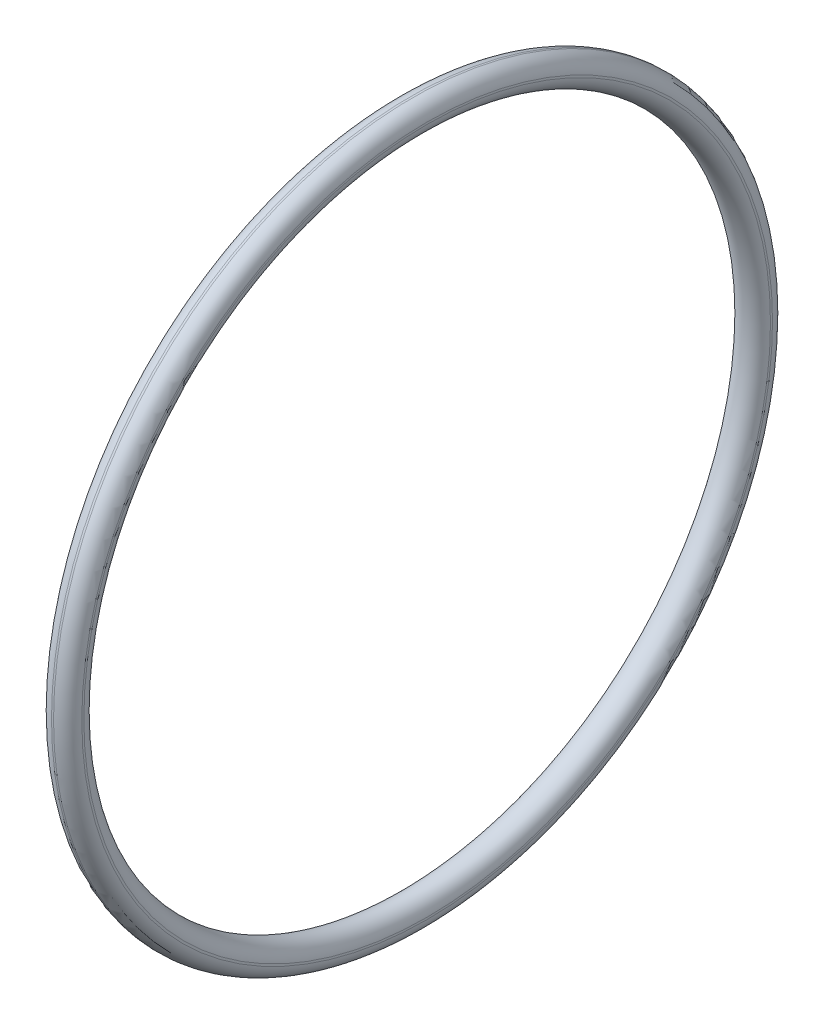
ISO-10303-21;
HEADER;
FILE_DESCRIPTION(('STEP AP214'),'2;1');
FILE_NAME('part.step','',(''),(''),'','','');
FILE_SCHEMA(('AUTOMOTIVE_DESIGN { 1 0 10303 214 1 1 1 1 }'));
ENDSEC;
DATA;
#1=APPLICATION_CONTEXT('core data for automotive mechanical design processes');
#2=APPLICATION_PROTOCOL_DEFINITION('international standard','automotive_design',2000,#1);
#3=PRODUCT_CONTEXT('',#1,'mechanical');
#4=PRODUCT('Part','Part','',(#3));
#5=PRODUCT_RELATED_PRODUCT_CATEGORY('part','',(#4));
#6=PRODUCT_DEFINITION_FORMATION('','',#4);
#7=PRODUCT_DEFINITION_CONTEXT('part definition',#1,'design');
#8=PRODUCT_DEFINITION('design','',#6,#7);
#9=PRODUCT_DEFINITION_SHAPE('','',#8);
#10=(LENGTH_UNIT() NAMED_UNIT(*) SI_UNIT(.MILLI.,.METRE.));
#11=(NAMED_UNIT(*) PLANE_ANGLE_UNIT() SI_UNIT($,.RADIAN.));
#12=(NAMED_UNIT(*) SI_UNIT($,.STERADIAN.) SOLID_ANGLE_UNIT());
#13=UNCERTAINTY_MEASURE_WITH_UNIT(LENGTH_MEASURE(1.E-05),#10,'distance_accuracy_value','');
#14=(GEOMETRIC_REPRESENTATION_CONTEXT(3) GLOBAL_UNCERTAINTY_ASSIGNED_CONTEXT((#13)) GLOBAL_UNIT_ASSIGNED_CONTEXT((#10,
#11,#12)) REPRESENTATION_CONTEXT('',''));
#15=CARTESIAN_POINT('',(0.,0.,0.));
#16=DIRECTION('',(0.,0.,1.));
#17=DIRECTION('',(1.,0.,0.));
#18=AXIS2_PLACEMENT_3D('',#15,#16,#17);
#19=CARTESIAN_POINT('',(0.,0.,0.));
#20=DIRECTION('',(-1.,0.,0.));
#21=DIRECTION('',(0.,0.,1.));
#22=AXIS2_PLACEMENT_3D('',#19,#20,#21);
#23=TOROIDAL_SURFACE('',#22,34.,1.5);
#24=CARTESIAN_POINT('',(1.49666295470958,0.,0.));
#25=DIRECTION('',(-1.,0.,0.));
#26=DIRECTION('',(0.,0.,1.));
#27=AXIS2_PLACEMENT_3D('',#24,#25,#26);
#28=CIRCLE('',#27,33.9);
#29=CARTESIAN_POINT('',(1.49666295470958,0.,33.9));
#30=VERTEX_POINT('',#29);
#31=EDGE_CURVE('E10',#30,#30,#28,.T.);
#32=ORIENTED_EDGE('',*,*,#31,.F.);
#33=EDGE_LOOP('',(#32));
#34=FACE_BOUND('',#33,.T.);
#35=CARTESIAN_POINT('',(-0.1,0.,0.));
#36=DIRECTION('',(-1.,0.,0.));
#37=DIRECTION('',(0.,0.,1.));
#38=AXIS2_PLACEMENT_3D('',#35,#36,#37);
#39=CIRCLE('',#38,35.4966629547096);
#40=CARTESIAN_POINT('',(-0.1,0.,35.4966629547096));
#41=VERTEX_POINT('',#40);
#42=EDGE_CURVE('E46',#41,#41,#39,.T.);
#43=ORIENTED_EDGE('',*,*,#42,.T.);
#44=EDGE_LOOP('',(#43));
#45=FACE_BOUND('',#44,.T.);
#46=ADVANCED_FACE('F32',(#34,#45),#23,.T.);
#47=CARTESIAN_POINT('',(1.49666295470958,33.9,0.));
#48=DIRECTION('',(-1.,0.,0.));
#49=DIRECTION('',(0.,0.,1.));
#50=AXIS2_PLACEMENT_3D('',#47,#48,#49);
#51=PLANE('',#50);
#52=CARTESIAN_POINT('',(1.49666295470958,0.,0.));
#53=DIRECTION('',(-1.,0.,0.));
#54=DIRECTION('',(0.,0.,1.));
#55=AXIS2_PLACEMENT_3D('',#52,#53,#54);
#56=CIRCLE('',#55,34.1);
#57=CARTESIAN_POINT('',(1.49666295470958,0.,34.1));
#58=VERTEX_POINT('',#57);
#59=EDGE_CURVE('E38',#58,#58,#56,.T.);
#60=ORIENTED_EDGE('',*,*,#59,.F.);
#61=EDGE_LOOP('',(#60));
#62=FACE_BOUND('',#61,.T.);
#63=ORIENTED_EDGE('',*,*,#31,.T.);
#64=EDGE_LOOP('',(#63));
#65=FACE_BOUND('',#64,.T.);
#66=ADVANCED_FACE('F61',(#62,#65),#51,.F.);
#67=CARTESIAN_POINT('',(0.,0.,0.));
#68=DIRECTION('',(-1.,0.,0.));
#69=DIRECTION('',(0.,0.,1.));
#70=AXIS2_PLACEMENT_3D('',#67,#68,#69);
#71=TOROIDAL_SURFACE('',#70,34.,1.5);
#72=CARTESIAN_POINT('',(0.1,0.,0.));
#73=DIRECTION('',(-1.,0.,0.));
#74=DIRECTION('',(0.,0.,1.));
#75=AXIS2_PLACEMENT_3D('',#72,#73,#74);
#76=CIRCLE('',#75,35.4966629547096);
#77=CARTESIAN_POINT('',(0.1,0.,35.4966629547096));
#78=VERTEX_POINT('',#77);
#79=EDGE_CURVE('E42',#78,#78,#76,.T.);
#80=ORIENTED_EDGE('',*,*,#79,.F.);
#81=EDGE_LOOP('',(#80));
#82=FACE_BOUND('',#81,.T.);
#83=ORIENTED_EDGE('',*,*,#59,.T.);
#84=EDGE_LOOP('',(#83));
#85=FACE_BOUND('',#84,.T.);
#86=ADVANCED_FACE('F56',(#82,#85),#71,.T.);
#87=CARTESIAN_POINT('',(0.,0.,0.));
#88=DIRECTION('',(-1.,0.,0.));
#89=DIRECTION('',(0.,0.,1.));
#90=AXIS2_PLACEMENT_3D('',#87,#88,#89);
#91=CYLINDRICAL_SURFACE('',#90,35.4966629547096);
#92=ORIENTED_EDGE('',*,*,#42,.F.);
#93=EDGE_LOOP('',(#92));
#94=FACE_BOUND('',#93,.T.);
#95=ORIENTED_EDGE('',*,*,#79,.T.);
#96=EDGE_LOOP('',(#95));
#97=FACE_BOUND('',#96,.T.);
#98=ADVANCED_FACE('F53',(#94,#97),#91,.T.);
#99=CLOSED_SHELL('',(#46,#66,#86,#98));
#100=MANIFOLD_SOLID_BREP('B2',#99);
#101=ADVANCED_BREP_SHAPE_REPRESENTATION('',(#18,#100),#14);
#102=SHAPE_DEFINITION_REPRESENTATION(#9,#101);
ENDSEC;
END-ISO-10303-21;
